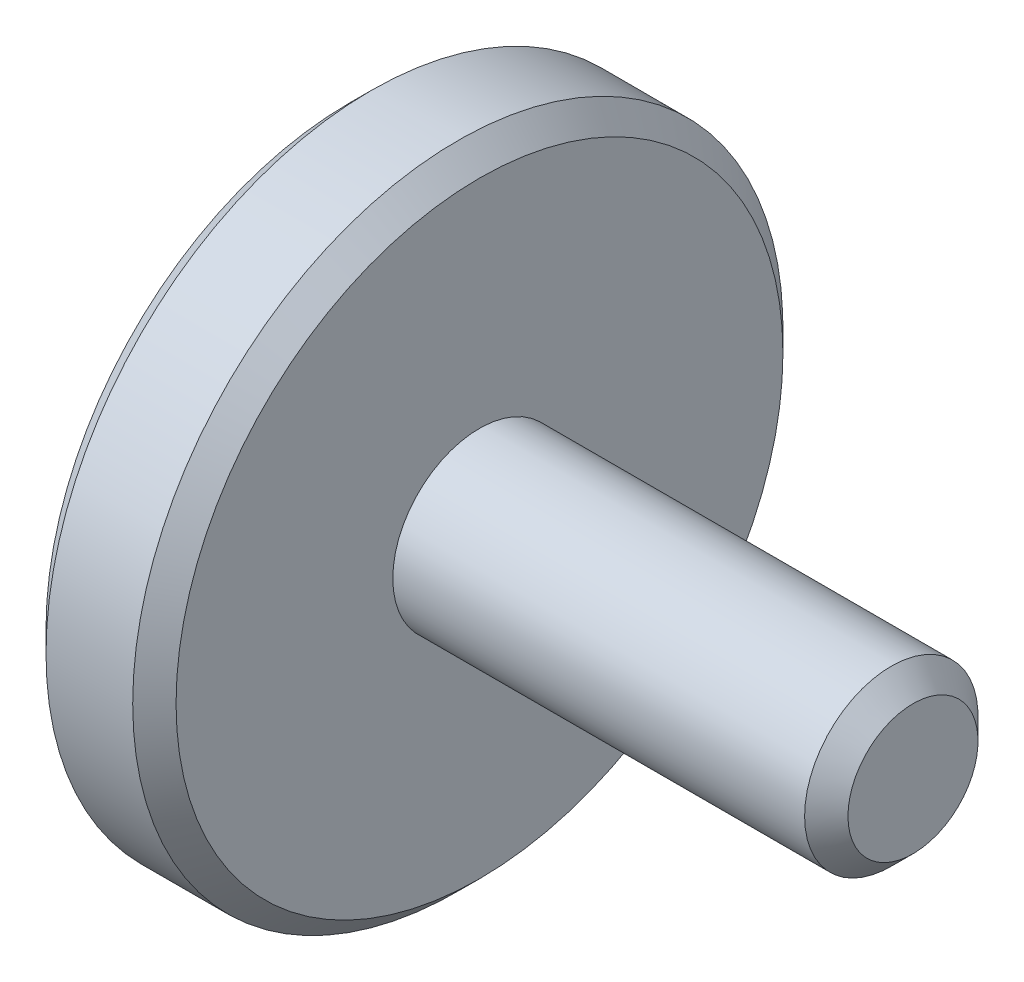
ISO-10303-21;
HEADER;
FILE_DESCRIPTION(('STEP AP214'),'2;1');
FILE_NAME('part.step','',(''),(''),'','','');
FILE_SCHEMA(('AUTOMOTIVE_DESIGN { 1 0 10303 214 1 1 1 1 }'));
ENDSEC;
DATA;
#1=APPLICATION_CONTEXT('core data for automotive mechanical design processes');
#2=APPLICATION_PROTOCOL_DEFINITION('international standard','automotive_design',2000,#1);
#3=PRODUCT_CONTEXT('',#1,'mechanical');
#4=PRODUCT('Part','Part','',(#3));
#5=PRODUCT_RELATED_PRODUCT_CATEGORY('part','',(#4));
#6=PRODUCT_DEFINITION_FORMATION('','',#4);
#7=PRODUCT_DEFINITION_CONTEXT('part definition',#1,'design');
#8=PRODUCT_DEFINITION('design','',#6,#7);
#9=PRODUCT_DEFINITION_SHAPE('','',#8);
#10=(LENGTH_UNIT() NAMED_UNIT(*) SI_UNIT(.MILLI.,.METRE.));
#11=(NAMED_UNIT(*) PLANE_ANGLE_UNIT() SI_UNIT($,.RADIAN.));
#12=(NAMED_UNIT(*) SI_UNIT($,.STERADIAN.) SOLID_ANGLE_UNIT());
#13=UNCERTAINTY_MEASURE_WITH_UNIT(LENGTH_MEASURE(1.E-05),#10,'distance_accuracy_value','');
#14=(GEOMETRIC_REPRESENTATION_CONTEXT(3) GLOBAL_UNCERTAINTY_ASSIGNED_CONTEXT((#13)) GLOBAL_UNIT_ASSIGNED_CONTEXT((#10,
#11,#12)) REPRESENTATION_CONTEXT('',''));
#15=CARTESIAN_POINT('',(0.,0.,0.));
#16=DIRECTION('',(0.,0.,1.));
#17=DIRECTION('',(1.,0.,0.));
#18=AXIS2_PLACEMENT_3D('',#15,#16,#17);
#19=CARTESIAN_POINT('',(0.,0.,0.));
#20=DIRECTION('',(1.,0.,0.));
#21=DIRECTION('',(0.,0.,-1.));
#22=AXIS2_PLACEMENT_3D('',#19,#20,#21);
#23=PLANE('',#22);
#24=CARTESIAN_POINT('',(0.,0.,0.));
#25=DIRECTION('',(1.,0.,0.));
#26=DIRECTION('',(0.,0.,-1.));
#27=AXIS2_PLACEMENT_3D('',#24,#25,#26);
#28=CIRCLE('',#27,7.00000000000001);
#29=CARTESIAN_POINT('',(0.,0.,-7.00000000000001));
#30=VERTEX_POINT('',#29);
#31=EDGE_CURVE('E55',#30,#30,#28,.F.);
#32=ORIENTED_EDGE('',*,*,#31,.T.);
#33=EDGE_LOOP('',(#32));
#34=FACE_BOUND('',#33,.T.);
#35=ADVANCED_FACE('F32',(#34),#23,.F.);
#36=CARTESIAN_POINT('',(-65.1704105238394,0.,0.));
#37=DIRECTION('',(-1.,0.,0.));
#38=DIRECTION('',(0.,0.,1.));
#39=AXIS2_PLACEMENT_3D('',#36,#37,#38);
#40=CYLINDRICAL_SURFACE('',#39,7.5);
#41=CARTESIAN_POINT('',(0.5,0.,0.));
#42=DIRECTION('',(1.,0.,0.));
#43=DIRECTION('',(0.,0.,-1.));
#44=AXIS2_PLACEMENT_3D('',#41,#42,#43);
#45=CIRCLE('',#44,7.5);
#46=CARTESIAN_POINT('',(0.5,0.,-7.5));
#47=VERTEX_POINT('',#46);
#48=EDGE_CURVE('E47',#47,#47,#45,.T.);
#49=ORIENTED_EDGE('',*,*,#48,.T.);
#50=EDGE_LOOP('',(#49));
#51=FACE_BOUND('',#50,.T.);
#52=CARTESIAN_POINT('',(2.5,0.,0.));
#53=DIRECTION('',(-1.,0.,0.));
#54=DIRECTION('',(0.,0.,1.));
#55=AXIS2_PLACEMENT_3D('',#52,#53,#54);
#56=CIRCLE('',#55,7.5);
#57=CARTESIAN_POINT('',(2.5,0.,7.5));
#58=VERTEX_POINT('',#57);
#59=EDGE_CURVE('E52',#58,#58,#56,.T.);
#60=ORIENTED_EDGE('',*,*,#59,.T.);
#61=EDGE_LOOP('',(#60));
#62=FACE_BOUND('',#61,.T.);
#63=ADVANCED_FACE('F74',(#51,#62),#40,.T.);
#64=CARTESIAN_POINT('',(3.,7.5,0.));
#65=DIRECTION('',(-1.,0.,0.));
#66=DIRECTION('',(0.,0.,1.));
#67=AXIS2_PLACEMENT_3D('',#64,#65,#66);
#68=PLANE('',#67);
#69=CARTESIAN_POINT('',(3.,0.,0.));
#70=DIRECTION('',(-1.,0.,0.));
#71=DIRECTION('',(0.,0.,1.));
#72=AXIS2_PLACEMENT_3D('',#69,#70,#71);
#73=CIRCLE('',#72,7.);
#74=CARTESIAN_POINT('',(3.,0.,7.));
#75=VERTEX_POINT('',#74);
#76=EDGE_CURVE('E43',#75,#75,#73,.F.);
#77=ORIENTED_EDGE('',*,*,#76,.T.);
#78=EDGE_LOOP('',(#77));
#79=FACE_BOUND('',#78,.T.);
#80=CARTESIAN_POINT('',(3.,0.,0.));
#81=DIRECTION('',(-1.,0.,0.));
#82=DIRECTION('',(0.,0.,1.));
#83=AXIS2_PLACEMENT_3D('',#80,#81,#82);
#84=CIRCLE('',#83,2.);
#85=CARTESIAN_POINT('',(3.,0.,2.));
#86=VERTEX_POINT('',#85);
#87=EDGE_CURVE('E58',#86,#86,#84,.T.);
#88=ORIENTED_EDGE('',*,*,#87,.T.);
#89=EDGE_LOOP('',(#88));
#90=FACE_BOUND('',#89,.T.);
#91=ADVANCED_FACE('F62',(#79,#90),#68,.F.);
#92=CARTESIAN_POINT('',(-65.1704105238394,0.,0.));
#93=DIRECTION('',(-1.,0.,0.));
#94=DIRECTION('',(0.,0.,1.));
#95=AXIS2_PLACEMENT_3D('',#92,#93,#94);
#96=CYLINDRICAL_SURFACE('',#95,2.);
#97=CARTESIAN_POINT('',(12.5,0.,0.));
#98=DIRECTION('',(-1.,0.,0.));
#99=DIRECTION('',(0.,0.,1.));
#100=AXIS2_PLACEMENT_3D('',#97,#98,#99);
#101=CIRCLE('',#100,2.);
#102=CARTESIAN_POINT('',(12.5,0.,2.));
#103=VERTEX_POINT('',#102);
#104=EDGE_CURVE('E39',#103,#103,#101,.T.);
#105=ORIENTED_EDGE('',*,*,#104,.T.);
#106=EDGE_LOOP('',(#105));
#107=FACE_BOUND('',#106,.T.);
#108=ORIENTED_EDGE('',*,*,#87,.F.);
#109=EDGE_LOOP('',(#108));
#110=FACE_BOUND('',#109,.T.);
#111=ADVANCED_FACE('F64',(#107,#110),#96,.T.);
#112=CARTESIAN_POINT('',(13.,2.,0.));
#113=DIRECTION('',(-1.,0.,0.));
#114=DIRECTION('',(0.,0.,1.));
#115=AXIS2_PLACEMENT_3D('',#112,#113,#114);
#116=PLANE('',#115);
#117=CARTESIAN_POINT('',(13.,0.,0.));
#118=DIRECTION('',(-1.,0.,0.));
#119=DIRECTION('',(0.,0.,1.));
#120=AXIS2_PLACEMENT_3D('',#117,#118,#119);
#121=CIRCLE('',#120,1.5);
#122=CARTESIAN_POINT('',(13.,0.,1.5));
#123=VERTEX_POINT('',#122);
#124=EDGE_CURVE('E10',#123,#123,#121,.F.);
#125=ORIENTED_EDGE('',*,*,#124,.T.);
#126=EDGE_LOOP('',(#125));
#127=FACE_BOUND('',#126,.T.);
#128=ADVANCED_FACE('F66',(#127),#116,.F.);
#129=CARTESIAN_POINT('',(0.,0.,0.));
#130=DIRECTION('',(1.,0.,0.));
#131=DIRECTION('',(0.,0.,-1.));
#132=AXIS2_PLACEMENT_3D('',#129,#130,#131);
#133=CONICAL_SURFACE('',#132,7.00000000000001,0.785398163397442);
#134=ORIENTED_EDGE('',*,*,#48,.F.);
#135=EDGE_LOOP('',(#134));
#136=FACE_BOUND('',#135,.T.);
#137=ORIENTED_EDGE('',*,*,#31,.F.);
#138=EDGE_LOOP('',(#137));
#139=FACE_BOUND('',#138,.T.);
#140=ADVANCED_FACE('F72',(#136,#139),#133,.T.);
#141=CARTESIAN_POINT('',(2.5,0.,0.));
#142=DIRECTION('',(-1.,0.,0.));
#143=DIRECTION('',(0.,0.,1.));
#144=AXIS2_PLACEMENT_3D('',#141,#142,#143);
#145=CONICAL_SURFACE('',#144,7.5,0.785398163397449);
#146=ORIENTED_EDGE('',*,*,#76,.F.);
#147=EDGE_LOOP('',(#146));
#148=FACE_BOUND('',#147,.T.);
#149=ORIENTED_EDGE('',*,*,#59,.F.);
#150=EDGE_LOOP('',(#149));
#151=FACE_BOUND('',#150,.T.);
#152=ADVANCED_FACE('F87',(#148,#151),#145,.T.);
#153=CARTESIAN_POINT('',(12.5,0.,0.));
#154=DIRECTION('',(-1.,0.,0.));
#155=DIRECTION('',(0.,0.,1.));
#156=AXIS2_PLACEMENT_3D('',#153,#154,#155);
#157=CONICAL_SURFACE('',#156,2.,0.785398163397457);
#158=ORIENTED_EDGE('',*,*,#124,.F.);
#159=EDGE_LOOP('',(#158));
#160=FACE_BOUND('',#159,.T.);
#161=ORIENTED_EDGE('',*,*,#104,.F.);
#162=EDGE_LOOP('',(#161));
#163=FACE_BOUND('',#162,.T.);
#164=ADVANCED_FACE('F34',(#160,#163),#157,.T.);
#165=CLOSED_SHELL('',(#35,#63,#91,#111,#128,#140,#152,#164));
#166=MANIFOLD_SOLID_BREP('B2',#165);
#167=ADVANCED_BREP_SHAPE_REPRESENTATION('',(#18,#166),#14);
#168=SHAPE_DEFINITION_REPRESENTATION(#9,#167);
ENDSEC;
END-ISO-10303-21;
